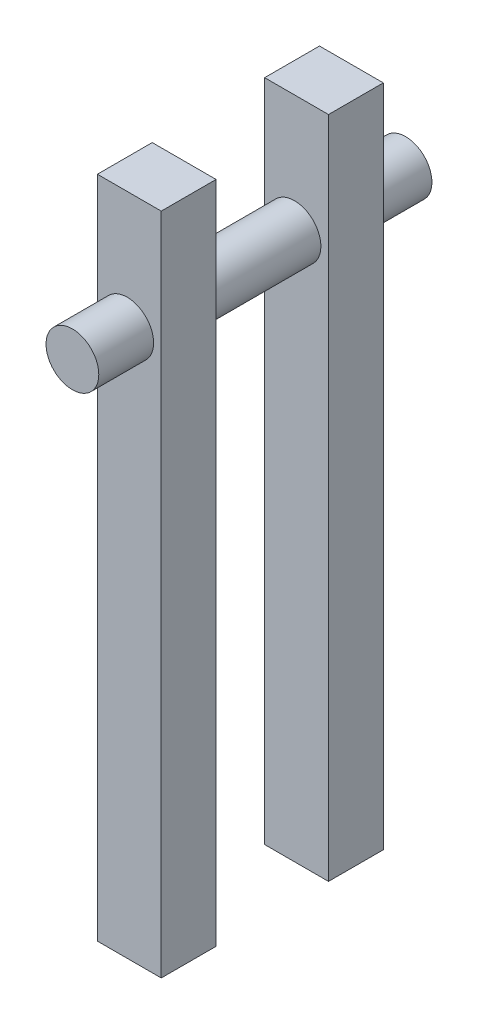
ISO-10303-21;
HEADER;
FILE_DESCRIPTION(('STEP AP214'),'2;1');
FILE_NAME('part.step','',(''),(''),'','','');
FILE_SCHEMA(('AUTOMOTIVE_DESIGN { 1 0 10303 214 1 1 1 1 }'));
ENDSEC;
DATA;
#1=APPLICATION_CONTEXT('core data for automotive mechanical design processes');
#2=APPLICATION_PROTOCOL_DEFINITION('international standard','automotive_design',2000,#1);
#3=PRODUCT_CONTEXT('',#1,'mechanical');
#4=PRODUCT('Part','Part','',(#3));
#5=PRODUCT_RELATED_PRODUCT_CATEGORY('part','',(#4));
#6=PRODUCT_DEFINITION_FORMATION('','',#4);
#7=PRODUCT_DEFINITION_CONTEXT('part definition',#1,'design');
#8=PRODUCT_DEFINITION('design','',#6,#7);
#9=PRODUCT_DEFINITION_SHAPE('','',#8);
#10=(LENGTH_UNIT() NAMED_UNIT(*) SI_UNIT(.MILLI.,.METRE.));
#11=(NAMED_UNIT(*) PLANE_ANGLE_UNIT() SI_UNIT($,.RADIAN.));
#12=(NAMED_UNIT(*) SI_UNIT($,.STERADIAN.) SOLID_ANGLE_UNIT());
#13=UNCERTAINTY_MEASURE_WITH_UNIT(LENGTH_MEASURE(1.E-05),#10,'distance_accuracy_value','');
#14=(GEOMETRIC_REPRESENTATION_CONTEXT(3) GLOBAL_UNCERTAINTY_ASSIGNED_CONTEXT((#13)) GLOBAL_UNIT_ASSIGNED_CONTEXT((#10,
#11,#12)) REPRESENTATION_CONTEXT('',''));
#15=CARTESIAN_POINT('',(0.,0.,0.));
#16=DIRECTION('',(0.,0.,1.));
#17=DIRECTION('',(1.,0.,0.));
#18=AXIS2_PLACEMENT_3D('',#15,#16,#17);
#19=CARTESIAN_POINT('',(4.3,30.1792452830189,-7.97830188679241));
#20=DIRECTION('',(0.,0.,1.));
#21=DIRECTION('',(1.,0.,0.));
#22=AXIS2_PLACEMENT_3D('',#19,#20,#21);
#23=CYLINDRICAL_SURFACE('',#22,3.8);
#24=CARTESIAN_POINT('',(4.3,30.1792452830189,24.2216981132076));
#25=DIRECTION('',(0.,0.,-1.));
#26=DIRECTION('',(0.,1.,0.));
#27=AXIS2_PLACEMENT_3D('',#24,#25,#26);
#28=CIRCLE('',#27,3.8);
#29=CARTESIAN_POINT('',(4.3,33.9792452830189,24.2216981132076));
#30=VERTEX_POINT('',#29);
#31=EDGE_CURVE('E11',#30,#30,#28,.T.);
#32=ORIENTED_EDGE('',*,*,#31,.T.);
#33=EDGE_LOOP('',(#32));
#34=FACE_BOUND('',#33,.T.);
#35=CARTESIAN_POINT('',(4.3,30.1792452830189,8.02169811320759));
#36=DIRECTION('',(0.,0.,-1.));
#37=DIRECTION('',(0.,1.,0.));
#38=AXIS2_PLACEMENT_3D('',#35,#36,#37);
#39=CIRCLE('',#38,3.8);
#40=CARTESIAN_POINT('',(4.3,33.9792452830189,8.02169811320759));
#41=VERTEX_POINT('',#40);
#42=EDGE_CURVE('E43',#41,#41,#39,.F.);
#43=ORIENTED_EDGE('',*,*,#42,.T.);
#44=EDGE_LOOP('',(#43));
#45=FACE_BOUND('',#44,.T.);
#46=ADVANCED_FACE('F39',(#34,#45),#23,.T.);
#47=CARTESIAN_POINT('',(9.2,47.1792452830189,32.1216981132076));
#48=DIRECTION('',(0.,1.,0.));
#49=DIRECTION('',(0.,0.,1.));
#50=AXIS2_PLACEMENT_3D('',#47,#48,#49);
#51=PLANE('',#50);
#52=DIRECTION('',(0.,0.,-1.));
#53=VECTOR('',#52,1.);
#54=CARTESIAN_POINT('',(0.,47.1792452830189,32.1216981132076));
#55=LINE('',#54,#53);
#56=CARTESIAN_POINT('',(0.,47.1792452830189,32.1216981132076));
#57=VERTEX_POINT('',#56);
#58=CARTESIAN_POINT('',(0.,47.1792452830189,24.2216981132076));
#59=VERTEX_POINT('',#58);
#60=EDGE_CURVE('E162',#57,#59,#55,.T.);
#61=ORIENTED_EDGE('',*,*,#60,.F.);
#62=DIRECTION('',(-1.,0.,0.));
#63=VECTOR('',#62,1.);
#64=CARTESIAN_POINT('',(9.2,47.1792452830189,32.1216981132076));
#65=LINE('',#64,#63);
#66=CARTESIAN_POINT('',(9.2,47.1792452830189,32.1216981132076));
#67=VERTEX_POINT('',#66);
#68=EDGE_CURVE('E50',#67,#57,#65,.T.);
#69=ORIENTED_EDGE('',*,*,#68,.F.);
#70=DIRECTION('',(0.,0.,-1.));
#71=VECTOR('',#70,1.);
#72=CARTESIAN_POINT('',(9.2,47.1792452830189,32.1216981132076));
#73=LINE('',#72,#71);
#74=CARTESIAN_POINT('',(9.2,47.1792452830189,24.2216981132076));
#75=VERTEX_POINT('',#74);
#76=EDGE_CURVE('E163',#67,#75,#73,.T.);
#77=ORIENTED_EDGE('',*,*,#76,.T.);
#78=DIRECTION('',(-1.,0.,0.));
#79=VECTOR('',#78,1.);
#80=CARTESIAN_POINT('',(9.2,47.1792452830189,24.2216981132076));
#81=LINE('',#80,#79);
#82=EDGE_CURVE('E84',#75,#59,#81,.T.);
#83=ORIENTED_EDGE('',*,*,#82,.T.);
#84=EDGE_LOOP('',(#61,#69,#77,#83));
#85=FACE_BOUND('',#84,.T.);
#86=ADVANCED_FACE('F41',(#85),#51,.T.);
#87=CARTESIAN_POINT('',(9.2,47.1792452830189,32.1216981132076));
#88=DIRECTION('',(0.,0.,-1.));
#89=DIRECTION('',(0.,1.,0.));
#90=AXIS2_PLACEMENT_3D('',#87,#88,#89);
#91=PLANE('',#90);
#92=CARTESIAN_POINT('',(4.3,30.1792452830189,32.1216981132076));
#93=DIRECTION('',(0.,0.,-1.));
#94=DIRECTION('',(0.,1.,0.));
#95=AXIS2_PLACEMENT_3D('',#92,#93,#94);
#96=CIRCLE('',#95,3.8);
#97=CARTESIAN_POINT('',(4.3,33.9792452830189,32.1216981132076));
#98=VERTEX_POINT('',#97);
#99=EDGE_CURVE('E158',#98,#98,#96,.T.);
#100=ORIENTED_EDGE('',*,*,#99,.T.);
#101=EDGE_LOOP('',(#100));
#102=FACE_BOUND('',#101,.T.);
#103=DIRECTION('',(0.,-1.,0.));
#104=VECTOR('',#103,1.);
#105=CARTESIAN_POINT('',(0.,47.1792452830189,32.1216981132076));
#106=LINE('',#105,#104);
#107=CARTESIAN_POINT('',(0.,-48.5207547169811,32.1216981132076));
#108=VERTEX_POINT('',#107);
#109=EDGE_CURVE('E76',#57,#108,#106,.T.);
#110=ORIENTED_EDGE('',*,*,#109,.T.);
#111=DIRECTION('',(-1.,0.,0.));
#112=VECTOR('',#111,1.);
#113=CARTESIAN_POINT('',(9.2,-48.5207547169811,32.1216981132076));
#114=LINE('',#113,#112);
#115=CARTESIAN_POINT('',(9.2,-48.5207547169811,32.1216981132076));
#116=VERTEX_POINT('',#115);
#117=EDGE_CURVE('E190',#116,#108,#114,.T.);
#118=ORIENTED_EDGE('',*,*,#117,.F.);
#119=DIRECTION('',(0.,-1.,0.));
#120=VECTOR('',#119,1.);
#121=CARTESIAN_POINT('',(9.2,47.1792452830189,32.1216981132076));
#122=LINE('',#121,#120);
#123=EDGE_CURVE('E172',#67,#116,#122,.T.);
#124=ORIENTED_EDGE('',*,*,#123,.F.);
#125=ORIENTED_EDGE('',*,*,#68,.T.);
#126=EDGE_LOOP('',(#110,#118,#124,#125));
#127=FACE_BOUND('',#126,.T.);
#128=ADVANCED_FACE('F206',(#102,#127),#91,.F.);
#129=CARTESIAN_POINT('',(9.2,-48.5207547169811,32.1216981132076));
#130=DIRECTION('',(0.,1.,0.));
#131=DIRECTION('',(0.,0.,1.));
#132=AXIS2_PLACEMENT_3D('',#129,#130,#131);
#133=PLANE('',#132);
#134=DIRECTION('',(0.,0.,-1.));
#135=VECTOR('',#134,1.);
#136=CARTESIAN_POINT('',(0.,-48.5207547169811,32.1216981132076));
#137=LINE('',#136,#135);
#138=CARTESIAN_POINT('',(0.,-48.5207547169811,24.2216981132076));
#139=VERTEX_POINT('',#138);
#140=EDGE_CURVE('E182',#108,#139,#137,.T.);
#141=ORIENTED_EDGE('',*,*,#140,.T.);
#142=DIRECTION('',(-1.,0.,0.));
#143=VECTOR('',#142,1.);
#144=CARTESIAN_POINT('',(9.2,-48.5207547169811,24.2216981132076));
#145=LINE('',#144,#143);
#146=CARTESIAN_POINT('',(9.2,-48.5207547169811,24.2216981132076));
#147=VERTEX_POINT('',#146);
#148=EDGE_CURVE('E193',#147,#139,#145,.T.);
#149=ORIENTED_EDGE('',*,*,#148,.F.);
#150=DIRECTION('',(0.,0.,-1.));
#151=VECTOR('',#150,1.);
#152=CARTESIAN_POINT('',(9.2,-48.5207547169811,32.1216981132076));
#153=LINE('',#152,#151);
#154=EDGE_CURVE('E169',#116,#147,#153,.T.);
#155=ORIENTED_EDGE('',*,*,#154,.F.);
#156=ORIENTED_EDGE('',*,*,#117,.T.);
#157=EDGE_LOOP('',(#141,#149,#155,#156));
#158=FACE_BOUND('',#157,.T.);
#159=ADVANCED_FACE('F204',(#158),#133,.F.);
#160=CARTESIAN_POINT('',(9.2,47.1792452830189,24.2216981132076));
#161=DIRECTION('',(0.,0.,-1.));
#162=DIRECTION('',(0.,1.,0.));
#163=AXIS2_PLACEMENT_3D('',#160,#161,#162);
#164=PLANE('',#163);
#165=ORIENTED_EDGE('',*,*,#31,.F.);
#166=EDGE_LOOP('',(#165));
#167=FACE_BOUND('',#166,.T.);
#168=DIRECTION('',(0.,-1.,0.));
#169=VECTOR('',#168,1.);
#170=CARTESIAN_POINT('',(0.,47.1792452830189,24.2216981132076));
#171=LINE('',#170,#169);
#172=EDGE_CURVE('E178',#59,#139,#171,.T.);
#173=ORIENTED_EDGE('',*,*,#172,.F.);
#174=ORIENTED_EDGE('',*,*,#82,.F.);
#175=DIRECTION('',(0.,-1.,0.));
#176=VECTOR('',#175,1.);
#177=CARTESIAN_POINT('',(9.2,47.1792452830189,24.2216981132076));
#178=LINE('',#177,#176);
#179=EDGE_CURVE('E166',#75,#147,#178,.T.);
#180=ORIENTED_EDGE('',*,*,#179,.T.);
#181=ORIENTED_EDGE('',*,*,#148,.T.);
#182=EDGE_LOOP('',(#173,#174,#180,#181));
#183=FACE_BOUND('',#182,.T.);
#184=ADVANCED_FACE('F198',(#167,#183),#164,.T.);
#185=CARTESIAN_POINT('',(9.2,0.,0.));
#186=DIRECTION('',(-1.,0.,0.));
#187=DIRECTION('',(0.,0.,1.));
#188=AXIS2_PLACEMENT_3D('',#185,#186,#187);
#189=PLANE('',#188);
#190=ORIENTED_EDGE('',*,*,#76,.F.);
#191=ORIENTED_EDGE('',*,*,#123,.T.);
#192=ORIENTED_EDGE('',*,*,#154,.T.);
#193=ORIENTED_EDGE('',*,*,#179,.F.);
#194=EDGE_LOOP('',(#190,#191,#192,#193));
#195=FACE_BOUND('',#194,.T.);
#196=ADVANCED_FACE('F208',(#195),#189,.F.);
#197=CARTESIAN_POINT('',(0.,0.,0.));
#198=DIRECTION('',(-1.,0.,0.));
#199=DIRECTION('',(0.,0.,1.));
#200=AXIS2_PLACEMENT_3D('',#197,#198,#199);
#201=PLANE('',#200);
#202=ORIENTED_EDGE('',*,*,#60,.T.);
#203=ORIENTED_EDGE('',*,*,#172,.T.);
#204=ORIENTED_EDGE('',*,*,#140,.F.);
#205=ORIENTED_EDGE('',*,*,#109,.F.);
#206=EDGE_LOOP('',(#202,#203,#204,#205));
#207=FACE_BOUND('',#206,.T.);
#208=ADVANCED_FACE('F202',(#207),#201,.T.);
#209=CARTESIAN_POINT('',(4.3,30.1792452830189,40.0216981132076));
#210=DIRECTION('',(0.,0.,1.));
#211=DIRECTION('',(1.,0.,0.));
#212=AXIS2_PLACEMENT_3D('',#209,#210,#211);
#213=CIRCLE('',#212,3.8);
#214=CARTESIAN_POINT('',(8.1,30.1792452830189,40.0216981132076));
#215=VERTEX_POINT('',#214);
#216=EDGE_CURVE('E150',#215,#215,#213,.T.);
#217=ORIENTED_EDGE('',*,*,#216,.F.);
#218=EDGE_LOOP('',(#217));
#219=FACE_BOUND('',#218,.T.);
#220=ORIENTED_EDGE('',*,*,#99,.F.);
#221=EDGE_LOOP('',(#220));
#222=FACE_BOUND('',#221,.T.);
#223=ADVANCED_FACE('F215',(#219,#222),#23,.T.);
#224=CARTESIAN_POINT('',(4.3,30.1792452830189,40.0216981132076));
#225=DIRECTION('',(0.,0.,1.));
#226=DIRECTION('',(1.,0.,0.));
#227=AXIS2_PLACEMENT_3D('',#224,#225,#226);
#228=PLANE('',#227);
#229=ORIENTED_EDGE('',*,*,#216,.T.);
#230=EDGE_LOOP('',(#229));
#231=FACE_BOUND('',#230,.T.);
#232=ADVANCED_FACE('F233',(#231),#228,.T.);
#233=CARTESIAN_POINT('',(9.2,47.1792452830189,8.02169811320759));
#234=DIRECTION('',(0.,0.,-1.));
#235=DIRECTION('',(0.,1.,0.));
#236=AXIS2_PLACEMENT_3D('',#233,#234,#235);
#237=PLANE('',#236);
#238=ORIENTED_EDGE('',*,*,#42,.F.);
#239=EDGE_LOOP('',(#238));
#240=FACE_BOUND('',#239,.T.);
#241=DIRECTION('',(0.,-1.,0.));
#242=VECTOR('',#241,1.);
#243=CARTESIAN_POINT('',(0.,47.1792452830189,8.02169811320759));
#244=LINE('',#243,#242);
#245=CARTESIAN_POINT('',(0.,47.1792452830189,8.02169811320759));
#246=VERTEX_POINT('',#245);
#247=CARTESIAN_POINT('',(0.,-48.5207547169811,8.02169811320758));
#248=VERTEX_POINT('',#247);
#249=EDGE_CURVE('E139',#246,#248,#244,.T.);
#250=ORIENTED_EDGE('',*,*,#249,.T.);
#251=DIRECTION('',(-1.,0.,0.));
#252=VECTOR('',#251,1.);
#253=CARTESIAN_POINT('',(9.2,-48.5207547169811,8.02169811320758));
#254=LINE('',#253,#252);
#255=CARTESIAN_POINT('',(9.2,-48.5207547169811,8.02169811320758));
#256=VERTEX_POINT('',#255);
#257=EDGE_CURVE('E117',#256,#248,#254,.T.);
#258=ORIENTED_EDGE('',*,*,#257,.F.);
#259=DIRECTION('',(0.,-1.,0.));
#260=VECTOR('',#259,1.);
#261=CARTESIAN_POINT('',(9.2,47.1792452830189,8.02169811320759));
#262=LINE('',#261,#260);
#263=CARTESIAN_POINT('',(9.2,47.1792452830189,8.02169811320759));
#264=VERTEX_POINT('',#263);
#265=EDGE_CURVE('E125',#264,#256,#262,.T.);
#266=ORIENTED_EDGE('',*,*,#265,.F.);
#267=DIRECTION('',(-1.,0.,0.));
#268=VECTOR('',#267,1.);
#269=CARTESIAN_POINT('',(9.2,47.1792452830189,8.02169811320759));
#270=LINE('',#269,#268);
#271=EDGE_CURVE('E350',#264,#246,#270,.T.);
#272=ORIENTED_EDGE('',*,*,#271,.T.);
#273=EDGE_LOOP('',(#250,#258,#266,#272));
#274=FACE_BOUND('',#273,.T.);
#275=ADVANCED_FACE('F137',(#240,#274),#237,.F.);
#276=CARTESIAN_POINT('',(9.2,-48.5207547169811,8.02169811320758));
#277=DIRECTION('',(0.,1.,0.));
#278=DIRECTION('',(0.,0.,1.));
#279=AXIS2_PLACEMENT_3D('',#276,#277,#278);
#280=PLANE('',#279);
#281=DIRECTION('',(0.,0.,-1.));
#282=VECTOR('',#281,1.);
#283=CARTESIAN_POINT('',(0.,-48.5207547169811,8.02169811320758));
#284=LINE('',#283,#282);
#285=CARTESIAN_POINT('',(0.,-48.5207547169811,0.121698113207582));
#286=VERTEX_POINT('',#285);
#287=EDGE_CURVE('E347',#248,#286,#284,.T.);
#288=ORIENTED_EDGE('',*,*,#287,.T.);
#289=DIRECTION('',(-1.,0.,0.));
#290=VECTOR('',#289,1.);
#291=CARTESIAN_POINT('',(9.2,-48.5207547169811,0.121698113207582));
#292=LINE('',#291,#290);
#293=CARTESIAN_POINT('',(9.2,-48.5207547169811,0.121698113207582));
#294=VERTEX_POINT('',#293);
#295=EDGE_CURVE('E120',#294,#286,#292,.T.);
#296=ORIENTED_EDGE('',*,*,#295,.F.);
#297=DIRECTION('',(0.,0.,-1.));
#298=VECTOR('',#297,1.);
#299=CARTESIAN_POINT('',(9.2,-48.5207547169811,8.02169811320758));
#300=LINE('',#299,#298);
#301=EDGE_CURVE('E113',#256,#294,#300,.T.);
#302=ORIENTED_EDGE('',*,*,#301,.F.);
#303=ORIENTED_EDGE('',*,*,#257,.T.);
#304=EDGE_LOOP('',(#288,#296,#302,#303));
#305=FACE_BOUND('',#304,.T.);
#306=ADVANCED_FACE('F115',(#305),#280,.F.);
#307=CARTESIAN_POINT('',(9.2,47.1792452830189,0.121698113207589));
#308=DIRECTION('',(0.,0.,1.));
#309=DIRECTION('',(0.,-1.,0.));
#310=AXIS2_PLACEMENT_3D('',#307,#308,#309);
#311=PLANE('',#310);
#312=CARTESIAN_POINT('',(4.3,30.1792452830189,0.121698113207587));
#313=DIRECTION('',(0.,0.,1.));
#314=DIRECTION('',(0.,-1.,0.));
#315=AXIS2_PLACEMENT_3D('',#312,#313,#314);
#316=CIRCLE('',#315,3.8);
#317=CARTESIAN_POINT('',(4.3,26.3792452830189,0.121698113207587));
#318=VERTEX_POINT('',#317);
#319=EDGE_CURVE('E141',#318,#318,#316,.F.);
#320=ORIENTED_EDGE('',*,*,#319,.F.);
#321=EDGE_LOOP('',(#320));
#322=FACE_BOUND('',#321,.T.);
#323=DIRECTION('',(0.,1.,0.));
#324=VECTOR('',#323,1.);
#325=CARTESIAN_POINT('',(0.,47.1792452830189,0.121698113207589));
#326=LINE('',#325,#324);
#327=CARTESIAN_POINT('',(0.,47.1792452830189,0.121698113207589));
#328=VERTEX_POINT('',#327);
#329=EDGE_CURVE('E343',#286,#328,#326,.T.);
#330=ORIENTED_EDGE('',*,*,#329,.T.);
#331=DIRECTION('',(-1.,0.,0.));
#332=VECTOR('',#331,1.);
#333=CARTESIAN_POINT('',(9.2,47.1792452830189,0.121698113207589));
#334=LINE('',#333,#332);
#335=CARTESIAN_POINT('',(9.2,47.1792452830189,0.121698113207589));
#336=VERTEX_POINT('',#335);
#337=EDGE_CURVE('E146',#336,#328,#334,.T.);
#338=ORIENTED_EDGE('',*,*,#337,.F.);
#339=DIRECTION('',(0.,1.,0.));
#340=VECTOR('',#339,1.);
#341=CARTESIAN_POINT('',(9.2,47.1792452830189,0.121698113207589));
#342=LINE('',#341,#340);
#343=EDGE_CURVE('E124',#294,#336,#342,.T.);
#344=ORIENTED_EDGE('',*,*,#343,.F.);
#345=ORIENTED_EDGE('',*,*,#295,.T.);
#346=EDGE_LOOP('',(#330,#338,#344,#345));
#347=FACE_BOUND('',#346,.T.);
#348=ADVANCED_FACE('F289',(#322,#347),#311,.F.);
#349=CARTESIAN_POINT('',(9.2,47.1792452830189,8.02169811320759));
#350=DIRECTION('',(0.,-1.,0.));
#351=DIRECTION('',(0.,0.,-1.));
#352=AXIS2_PLACEMENT_3D('',#349,#350,#351);
#353=PLANE('',#352);
#354=DIRECTION('',(0.,0.,1.));
#355=VECTOR('',#354,1.);
#356=CARTESIAN_POINT('',(0.,47.1792452830189,8.02169811320759));
#357=LINE('',#356,#355);
#358=EDGE_CURVE('E135',#328,#246,#357,.T.);
#359=ORIENTED_EDGE('',*,*,#358,.T.);
#360=ORIENTED_EDGE('',*,*,#271,.F.);
#361=DIRECTION('',(0.,0.,1.));
#362=VECTOR('',#361,1.);
#363=CARTESIAN_POINT('',(9.2,47.1792452830189,8.02169811320759));
#364=LINE('',#363,#362);
#365=EDGE_CURVE('E130',#336,#264,#364,.T.);
#366=ORIENTED_EDGE('',*,*,#365,.F.);
#367=ORIENTED_EDGE('',*,*,#337,.T.);
#368=EDGE_LOOP('',(#359,#360,#366,#367));
#369=FACE_BOUND('',#368,.T.);
#370=ADVANCED_FACE('F297',(#369),#353,.F.);
#371=CARTESIAN_POINT('',(9.2,0.,0.));
#372=DIRECTION('',(1.,0.,0.));
#373=DIRECTION('',(0.,0.,-1.));
#374=AXIS2_PLACEMENT_3D('',#371,#372,#373);
#375=PLANE('',#374);
#376=ORIENTED_EDGE('',*,*,#265,.T.);
#377=ORIENTED_EDGE('',*,*,#301,.T.);
#378=ORIENTED_EDGE('',*,*,#343,.T.);
#379=ORIENTED_EDGE('',*,*,#365,.T.);
#380=EDGE_LOOP('',(#376,#377,#378,#379));
#381=FACE_BOUND('',#380,.T.);
#382=ADVANCED_FACE('F128',(#381),#375,.T.);
#383=CARTESIAN_POINT('',(0.,0.,0.));
#384=DIRECTION('',(1.,0.,0.));
#385=DIRECTION('',(0.,0.,-1.));
#386=AXIS2_PLACEMENT_3D('',#383,#384,#385);
#387=PLANE('',#386);
#388=ORIENTED_EDGE('',*,*,#249,.F.);
#389=ORIENTED_EDGE('',*,*,#358,.F.);
#390=ORIENTED_EDGE('',*,*,#329,.F.);
#391=ORIENTED_EDGE('',*,*,#287,.F.);
#392=EDGE_LOOP('',(#388,#389,#390,#391));
#393=FACE_BOUND('',#392,.T.);
#394=ADVANCED_FACE('F314',(#393),#387,.F.);
#395=CARTESIAN_POINT('',(4.3,30.1792452830189,-7.97830188679241));
#396=DIRECTION('',(0.,0.,1.));
#397=DIRECTION('',(1.,0.,0.));
#398=AXIS2_PLACEMENT_3D('',#395,#396,#397);
#399=PLANE('',#398);
#400=CARTESIAN_POINT('',(4.3,30.1792452830189,-7.97830188679241));
#401=DIRECTION('',(0.,0.,1.));
#402=DIRECTION('',(1.,0.,0.));
#403=AXIS2_PLACEMENT_3D('',#400,#401,#402);
#404=CIRCLE('',#403,3.8);
#405=CARTESIAN_POINT('',(8.1,30.1792452830189,-7.97830188679241));
#406=VERTEX_POINT('',#405);
#407=EDGE_CURVE('E154',#406,#406,#404,.T.);
#408=ORIENTED_EDGE('',*,*,#407,.F.);
#409=EDGE_LOOP('',(#408));
#410=FACE_BOUND('',#409,.T.);
#411=ADVANCED_FACE('F231',(#410),#399,.F.);
#412=ORIENTED_EDGE('',*,*,#407,.T.);
#413=EDGE_LOOP('',(#412));
#414=FACE_BOUND('',#413,.T.);
#415=ORIENTED_EDGE('',*,*,#319,.T.);
#416=EDGE_LOOP('',(#415));
#417=FACE_BOUND('',#416,.T.);
#418=ADVANCED_FACE('F222',(#414,#417),#23,.T.);
#419=CLOSED_SHELL('',(#46,#86,#128,#159,#184,#196,#208,#223,#232,#275,#306,#348,#370,#382,#394,
#411,#418));
#420=MANIFOLD_SOLID_BREP('B2',#419);
#421=ADVANCED_BREP_SHAPE_REPRESENTATION('',(#18,#420),#14);
#422=SHAPE_DEFINITION_REPRESENTATION(#9,#421);
ENDSEC;
END-ISO-10303-21;
